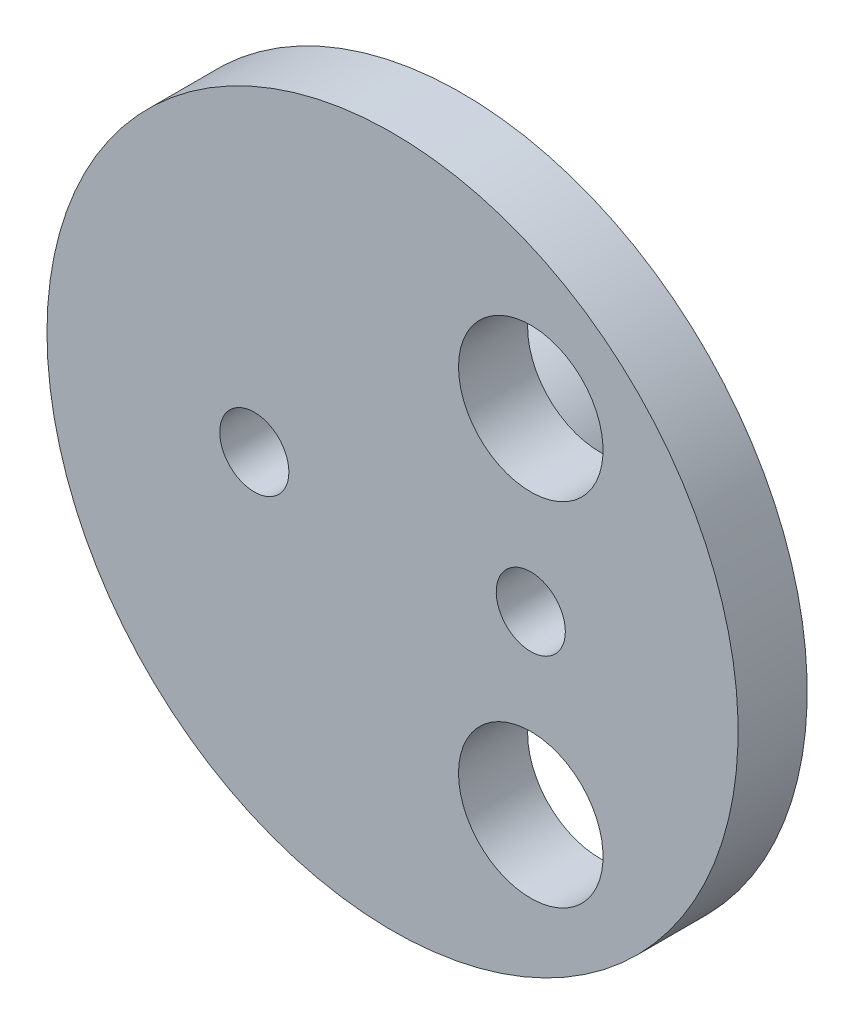
ISO-10303-21;
HEADER;
FILE_DESCRIPTION(('STEP AP214'),'2;1');
FILE_NAME('part.step','',(''),(''),'','','');
FILE_SCHEMA(('AUTOMOTIVE_DESIGN { 1 0 10303 214 1 1 1 1 }'));
ENDSEC;
DATA;
#1=APPLICATION_CONTEXT('core data for automotive mechanical design processes');
#2=APPLICATION_PROTOCOL_DEFINITION('international standard','automotive_design',2000,#1);
#3=PRODUCT_CONTEXT('',#1,'mechanical');
#4=PRODUCT('Part','Part','',(#3));
#5=PRODUCT_RELATED_PRODUCT_CATEGORY('part','',(#4));
#6=PRODUCT_DEFINITION_FORMATION('','',#4);
#7=PRODUCT_DEFINITION_CONTEXT('part definition',#1,'design');
#8=PRODUCT_DEFINITION('design','',#6,#7);
#9=PRODUCT_DEFINITION_SHAPE('','',#8);
#10=(LENGTH_UNIT() NAMED_UNIT(*) SI_UNIT(.MILLI.,.METRE.));
#11=(NAMED_UNIT(*) PLANE_ANGLE_UNIT() SI_UNIT($,.RADIAN.));
#12=(NAMED_UNIT(*) SI_UNIT($,.STERADIAN.) SOLID_ANGLE_UNIT());
#13=UNCERTAINTY_MEASURE_WITH_UNIT(LENGTH_MEASURE(1.E-05),#10,'distance_accuracy_value','');
#14=(GEOMETRIC_REPRESENTATION_CONTEXT(3) GLOBAL_UNCERTAINTY_ASSIGNED_CONTEXT((#13)) GLOBAL_UNIT_ASSIGNED_CONTEXT((#10,
#11,#12)) REPRESENTATION_CONTEXT('',''));
#15=CARTESIAN_POINT('',(0.,0.,0.));
#16=DIRECTION('',(0.,0.,1.));
#17=DIRECTION('',(1.,0.,0.));
#18=AXIS2_PLACEMENT_3D('',#15,#16,#17);
#19=CARTESIAN_POINT('',(2.44249065417534E-12,1.55431223447522E-12,2.5000000000015));
#20=DIRECTION('',(-1.01529895601971E-13,0.,0.999999999999969));
#21=DIRECTION('',(1.,0.,-1.18127729820117E-13));
#22=AXIS2_PLACEMENT_3D('',#19,#20,#21);
#23=PLANE('',#22);
#24=CARTESIAN_POINT('',(4.99999999999412,6.36396103066117,2.50000000010064));
#25=DIRECTION('',(-1.01529895601971E-13,0.,0.999999999999969));
#26=DIRECTION('',(1.,0.,-1.18127729820117E-13));
#27=AXIS2_PLACEMENT_3D('',#24,#25,#26);
#28=CIRCLE('',#27,2.61396103067893);
#29=CARTESIAN_POINT('',(2.38603896931518,6.3639610306612,2.50000000010038));
#30=VERTEX_POINT('',#29);
#31=EDGE_CURVE('E169',#30,#30,#28,.T.);
#32=ORIENTED_EDGE('',*,*,#31,.F.);
#33=EDGE_LOOP('',(#32));
#34=FACE_BOUND('',#33,.T.);
#35=CARTESIAN_POINT('',(4.99999999998835,9.70334923522387E-11,2.50000000010375));
#36=DIRECTION('',(-1.01529895601971E-13,0.,0.999999999999969));
#37=DIRECTION('',(1.,0.,-1.18127729820117E-13));
#38=AXIS2_PLACEMENT_3D('',#35,#36,#37);
#39=CIRCLE('',#38,1.25);
#40=CARTESIAN_POINT('',(6.24999999998835,9.70173160558252E-11,2.50000000010361));
#41=VERTEX_POINT('',#40);
#42=EDGE_CURVE('E89',#41,#41,#39,.T.);
#43=ORIENTED_EDGE('',*,*,#42,.F.);
#44=EDGE_LOOP('',(#43));
#45=FACE_BOUND('',#44,.T.);
#46=CARTESIAN_POINT('',(2.44249065417534E-12,1.55431223447522E-12,2.5000000000015));
#47=DIRECTION('',(-1.01529895601971E-13,0.,0.999999999999969));
#48=DIRECTION('',(1.,0.,-1.18127729820117E-13));
#49=AXIS2_PLACEMENT_3D('',#46,#47,#48);
#50=CIRCLE('',#49,12.5);
#51=CARTESIAN_POINT('',(-12.4999999999976,1.71607519860981E-12,2.50000000000023));
#52=VERTEX_POINT('',#51);
#53=EDGE_CURVE('E93',#52,#52,#50,.T.);
#54=ORIENTED_EDGE('',*,*,#53,.T.);
#55=EDGE_LOOP('',(#54));
#56=FACE_BOUND('',#55,.T.);
#57=CARTESIAN_POINT('',(-5.00000000000078,1.55431223447522E-12,2.5000000000005));
#58=DIRECTION('',(-1.01529895601971E-13,0.,0.999999999999969));
#59=DIRECTION('',(1.,0.,-1.18127729820117E-13));
#60=AXIS2_PLACEMENT_3D('',#57,#58,#59);
#61=CIRCLE('',#60,1.25);
#62=CARTESIAN_POINT('',(-3.75000000000078,1.53813593806174E-12,2.50000000000035));
#63=VERTEX_POINT('',#62);
#64=EDGE_CURVE('E86',#63,#63,#61,.T.);
#65=ORIENTED_EDGE('',*,*,#64,.F.);
#66=EDGE_LOOP('',(#65));
#67=FACE_BOUND('',#66,.T.);
#68=CARTESIAN_POINT('',(5.00000000000123,-6.3639610306776,2.50000000010264));
#69=DIRECTION('',(-1.01529895601971E-13,0.,0.999999999999969));
#70=DIRECTION('',(1.,0.,-1.18127729820117E-13));
#71=AXIS2_PLACEMENT_3D('',#68,#69,#70);
#72=CIRCLE('',#71,2.61396103067893);
#73=CARTESIAN_POINT('',(2.38603896932229,-6.36396103067757,2.50000000010238));
#74=VERTEX_POINT('',#73);
#75=EDGE_CURVE('E164',#74,#74,#72,.T.);
#76=ORIENTED_EDGE('',*,*,#75,.F.);
#77=EDGE_LOOP('',(#76));
#78=FACE_BOUND('',#77,.T.);
#79=ADVANCED_FACE('F39',(#34,#45,#56,#67,#78),#23,.T.);
#80=CARTESIAN_POINT('',(0.,0.,0.));
#81=DIRECTION('',(-1.01529895601971E-13,0.,0.999999999999969));
#82=DIRECTION('',(1.,0.,-1.18127729820117E-13));
#83=AXIS2_PLACEMENT_3D('',#80,#81,#82);
#84=PLANE('',#83);
#85=CARTESIAN_POINT('',(0.,0.,0.));
#86=DIRECTION('',(-1.01529895601971E-13,0.,0.999999999999969));
#87=DIRECTION('',(1.,0.,-1.18127729820117E-13));
#88=AXIS2_PLACEMENT_3D('',#85,#86,#87);
#89=CIRCLE('',#88,12.5);
#90=CARTESIAN_POINT('',(-12.4999999999973,1.49312853747713E-12,-1.26895022267703E-12));
#91=VERTEX_POINT('',#90);
#92=EDGE_CURVE('E43',#91,#91,#89,.T.);
#93=ORIENTED_EDGE('',*,*,#92,.F.);
#94=EDGE_LOOP('',(#93));
#95=FACE_BOUND('',#94,.T.);
#96=CARTESIAN_POINT('',(4.99999999999878,1.11022302462516E-12,1.02917674382752E-10));
#97=DIRECTION('',(-1.01529895601971E-13,0.,0.999999999999969));
#98=DIRECTION('',(1.,0.,-1.18127729820117E-13));
#99=AXIS2_PLACEMENT_3D('',#96,#97,#98);
#100=CIRCLE('',#99,1.25);
#101=CARTESIAN_POINT('',(4.84374999999071,-1.24019592698388,1.0369483049999E-10));
#102=VERTEX_POINT('',#101);
#103=CARTESIAN_POINT('',(4.84374999999515,1.24019592711533,1.0413891970984E-10));
#104=VERTEX_POINT('',#103);
#105=EDGE_CURVE('E82',#102,#104,#100,.T.);
#106=ORIENTED_EDGE('',*,*,#105,.T.);
#107=CARTESIAN_POINT('',(0.,0.,0.));
#108=DIRECTION('',(-1.01529895601971E-13,0.,0.999999999999969));
#109=DIRECTION('',(1.,0.,-1.18127729820117E-13));
#110=AXIS2_PLACEMENT_3D('',#107,#108,#109);
#111=CIRCLE('',#110,5.);
#112=CARTESIAN_POINT('',(-4.84375000000981,1.24019592711444,2.1094237467878E-12));
#113=VERTEX_POINT('',#112);
#114=EDGE_CURVE('E73',#104,#113,#111,.T.);
#115=ORIENTED_EDGE('',*,*,#114,.T.);
#116=CARTESIAN_POINT('',(-5.00000000000034,3.99680288865056E-12,-1.11022302462516E-13));
#117=DIRECTION('',(-1.01529895601971E-13,0.,0.999999999999969));
#118=DIRECTION('',(1.,0.,-1.18127729820117E-13));
#119=AXIS2_PLACEMENT_3D('',#116,#117,#118);
#120=CIRCLE('',#119,1.25);
#121=CARTESIAN_POINT('',(-4.84375000000137,-1.24019592703828,5.55111512312578E-13));
#122=VERTEX_POINT('',#121);
#123=EDGE_CURVE('E178',#113,#122,#120,.T.);
#124=ORIENTED_EDGE('',*,*,#123,.T.);
#125=EDGE_CURVE('E48',#122,#102,#111,.T.);
#126=ORIENTED_EDGE('',*,*,#125,.T.);
#127=EDGE_LOOP('',(#106,#115,#124,#126));
#128=FACE_BOUND('',#127,.T.);
#129=CARTESIAN_POINT('',(4.9999999999879,6.36396103064674,1.04471986617227E-10));
#130=DIRECTION('',(-1.01529895601971E-13,0.,0.999999999999969));
#131=DIRECTION('',(1.,0.,-1.18127729820117E-13));
#132=AXIS2_PLACEMENT_3D('',#129,#130,#131);
#133=CIRCLE('',#132,2.61396103067893);
#134=CARTESIAN_POINT('',(2.38603896931544,6.36396103066098,1.04207007606272E-10));
#135=VERTEX_POINT('',#134);
#136=EDGE_CURVE('E165',#135,#135,#133,.T.);
#137=ORIENTED_EDGE('',*,*,#136,.T.);
#138=EDGE_LOOP('',(#137));
#139=FACE_BOUND('',#138,.T.);
#140=CARTESIAN_POINT('',(4.99999999999723,-6.36396103065895,1.03361763592602E-10));
#141=DIRECTION('',(-1.01529895601971E-13,0.,0.999999999999969));
#142=DIRECTION('',(1.,0.,-1.18127729820117E-13));
#143=AXIS2_PLACEMENT_3D('',#140,#141,#142);
#144=CIRCLE('',#143,2.61396103067893);
#145=CARTESIAN_POINT('',(2.38603896932255,-6.36396103067779,1.03096784581647E-10));
#146=VERTEX_POINT('',#145);
#147=EDGE_CURVE('E166',#146,#146,#144,.T.);
#148=ORIENTED_EDGE('',*,*,#147,.T.);
#149=EDGE_LOOP('',(#148));
#150=FACE_BOUND('',#149,.T.);
#151=ADVANCED_FACE('F83',(#95,#128,#139,#150),#84,.F.);
#152=CARTESIAN_POINT('',(2.44249065417534E-12,1.55431223447522E-12,2.5000000000015));
#153=DIRECTION('',(1.01529895601971E-13,0.,-0.999999999999969));
#154=DIRECTION('',(-1.,0.,1.18127729820117E-13));
#155=AXIS2_PLACEMENT_3D('',#152,#153,#154);
#156=CYLINDRICAL_SURFACE('',#155,12.5);
#157=CARTESIAN_POINT('',(-12.4999999999976,1.71607519860981E-12,2.50000000000023));
#158=CARTESIAN_POINT('',(-12.4999999999976,1.71375283755635E-12,2.47395833333355));
#159=CARTESIAN_POINT('',(-12.4999999999976,1.71143047650288E-12,2.44791666666687));
#160=CARTESIAN_POINT('',(-12.4999999999976,1.70678575439595E-12,2.3958333333335));
#161=CARTESIAN_POINT('',(-12.4999999999976,1.70446339334248E-12,2.36979166666682));
#162=CARTESIAN_POINT('',(-12.4999999999976,1.69981867123555E-12,2.31770833333346));
#163=CARTESIAN_POINT('',(-12.4999999999976,1.69749631018209E-12,2.29166666666677));
#164=CARTESIAN_POINT('',(-12.4999999999976,1.69285158807516E-12,2.23958333333341));
#165=CARTESIAN_POINT('',(-12.4999999999976,1.69052922702169E-12,2.21354166666673));
#166=CARTESIAN_POINT('',(-12.4999999999976,1.68588450491476E-12,2.16145833333336));
#167=CARTESIAN_POINT('',(-12.4999999999976,1.6835621438613E-12,2.13541666666668));
#168=CARTESIAN_POINT('',(-12.4999999999976,1.67891742175436E-12,2.08333333333332));
#169=CARTESIAN_POINT('',(-12.4999999999976,1.6765950607009E-12,2.05729166666663));
#170=CARTESIAN_POINT('',(-12.4999999999975,1.67195033859397E-12,2.00520833333327));
#171=CARTESIAN_POINT('',(-12.4999999999975,1.6696279775405E-12,1.97916666666659));
#172=CARTESIAN_POINT('',(-12.4999999999975,1.66498325543357E-12,1.92708333333322));
#173=CARTESIAN_POINT('',(-12.4999999999975,1.66266089438011E-12,1.90104166666654));
#174=CARTESIAN_POINT('',(-12.4999999999975,1.65801617227318E-12,1.84895833333317));
#175=CARTESIAN_POINT('',(-12.4999999999975,1.65569381121971E-12,1.82291666666649));
#176=CARTESIAN_POINT('',(-12.4999999999975,1.65104908911278E-12,1.77083333333313));
#177=CARTESIAN_POINT('',(-12.4999999999975,1.64872672805931E-12,1.74479166666645));
#178=CARTESIAN_POINT('',(-12.4999999999975,1.64408200595238E-12,1.69270833333308));
#179=CARTESIAN_POINT('',(-12.4999999999975,1.64175964489892E-12,1.6666666666664));
#180=CARTESIAN_POINT('',(-12.4999999999975,1.63711492279199E-12,1.61458333333303));
#181=CARTESIAN_POINT('',(-12.4999999999975,1.63479256173852E-12,1.58854166666635));
#182=CARTESIAN_POINT('',(-12.4999999999975,1.63014783963159E-12,1.53645833333299));
#183=CARTESIAN_POINT('',(-12.4999999999975,1.62782547857813E-12,1.5104166666663));
#184=CARTESIAN_POINT('',(-12.4999999999975,1.62318075647119E-12,1.45833333333294));
#185=CARTESIAN_POINT('',(-12.4999999999975,1.62085839541773E-12,1.43229166666626));
#186=CARTESIAN_POINT('',(-12.4999999999975,1.6162136733108E-12,1.38020833333289));
#187=CARTESIAN_POINT('',(-12.4999999999975,1.61389131225733E-12,1.35416666666621));
#188=CARTESIAN_POINT('',(-12.4999999999975,1.6092465901504E-12,1.30208333333285));
#189=CARTESIAN_POINT('',(-12.4999999999975,1.60692422909694E-12,1.27604166666616));
#190=CARTESIAN_POINT('',(-12.4999999999975,1.60227950699001E-12,1.2239583333328));
#191=CARTESIAN_POINT('',(-12.4999999999975,1.59995714593654E-12,1.19791666666612));
#192=CARTESIAN_POINT('',(-12.4999999999975,1.59531242382961E-12,1.14583333333275));
#193=CARTESIAN_POINT('',(-12.4999999999975,1.59299006277614E-12,1.11979166666607));
#194=CARTESIAN_POINT('',(-12.4999999999975,1.58834534066921E-12,1.06770833333271));
#195=CARTESIAN_POINT('',(-12.4999999999974,1.58602297961575E-12,1.04166666666602));
#196=CARTESIAN_POINT('',(-12.4999999999974,1.58137825750882E-12,0.989583333332659));
#197=CARTESIAN_POINT('',(-12.4999999999974,1.57905589645535E-12,0.963541666665976));
#198=CARTESIAN_POINT('',(-12.4999999999974,1.57441117434842E-12,0.911458333332612));
#199=CARTESIAN_POINT('',(-12.4999999999974,1.57208881329496E-12,0.885416666665929));
#200=CARTESIAN_POINT('',(-12.4999999999974,1.56744409118802E-12,0.833333333332565));
#201=CARTESIAN_POINT('',(-12.4999999999974,1.56512173013456E-12,0.807291666665882));
#202=CARTESIAN_POINT('',(-12.4999999999974,1.56047700802763E-12,0.755208333332518));
#203=CARTESIAN_POINT('',(-12.4999999999974,1.55815464697416E-12,0.729166666665836));
#204=CARTESIAN_POINT('',(-12.4999999999974,1.55350992486723E-12,0.677083333332471));
#205=CARTESIAN_POINT('',(-12.4999999999974,1.55118756381377E-12,0.651041666665788));
#206=CARTESIAN_POINT('',(-12.4999999999974,1.54654284170684E-12,0.598958333332424));
#207=CARTESIAN_POINT('',(-12.4999999999974,1.54422048065337E-12,0.572916666665742));
#208=CARTESIAN_POINT('',(-12.4999999999974,1.53957575854644E-12,0.520833333332377));
#209=CARTESIAN_POINT('',(-12.4999999999974,1.53725339749297E-12,0.494791666665695));
#210=CARTESIAN_POINT('',(-12.4999999999974,1.53260867538604E-12,0.44270833333233));
#211=CARTESIAN_POINT('',(-12.4999999999974,1.53028631433258E-12,0.416666666665648));
#212=CARTESIAN_POINT('',(-12.4999999999974,1.52564159222565E-12,0.364583333332284));
#213=CARTESIAN_POINT('',(-12.4999999999974,1.52331923117218E-12,0.338541666665601));
#214=CARTESIAN_POINT('',(-12.4999999999974,1.51867450906525E-12,0.286458333332237));
#215=CARTESIAN_POINT('',(-12.4999999999974,1.51635214801179E-12,0.260416666665554));
#216=CARTESIAN_POINT('',(-12.4999999999974,1.51170742590485E-12,0.20833333333219));
#217=CARTESIAN_POINT('',(-12.4999999999974,1.50938506485139E-12,0.182291666665507));
#218=CARTESIAN_POINT('',(-12.4999999999974,1.50474034274446E-12,0.130208333332143));
#219=CARTESIAN_POINT('',(-12.4999999999974,1.50241798169099E-12,0.104166666665461));
#220=CARTESIAN_POINT('',(-12.4999999999973,1.49777325958406E-12,0.0520833333320959));
#221=CARTESIAN_POINT('',(-12.4999999999973,1.4954508985306E-12,0.0260416666654135));
#222=CARTESIAN_POINT('',(-12.4999999999973,1.49312853747713E-12,-1.26895022267703E-12));
#223=B_SPLINE_CURVE_WITH_KNOTS('',3,(#157,#158,#159,#160,#161,#162,#163,#164,#165,#166,#167,
#168,#169,#170,#171,#172,#173,#174,#175,#176,#177,#178,#179,#180,#181,#182,#183,#184,#185,#186,
#187,#188,#189,#190,#191,#192,#193,#194,#195,#196,#197,#198,#199,#200,#201,#202,#203,#204,#205,
#206,#207,#208,#209,#210,#211,#212,#213,#214,#215,#216,#217,#218,#219,#220,#221,#222),
.UNSPECIFIED.,.F.,.F.,(4,2,2,2,2,2,2,2,2,2,2,2,2,2,2,2,2,2,2,2,2,2,2,2,2,2,2,2,2,2,2,2,4),(0.,
0.0781250000000469,0.156250000000094,0.234375000000141,0.312500000000188,0.390625000000235,
0.468750000000281,0.546875000000329,0.625000000000375,0.703125000000422,0.781250000000469,
0.859375000000516,0.937500000000563,1.01562500000061,1.09375000000066,1.1718750000007,
1.25000000000075,1.3281250000008,1.40625000000084,1.48437500000089,1.56250000000094,
1.64062500000098,1.71875000000103,1.79687500000108,1.87500000000113,1.95312500000117,
2.03125000000122,2.10937500000127,2.18750000000131,2.26562500000136,2.34375000000141,
2.42187500000145,2.5000000000015),.UNSPECIFIED.);
#224=EDGE_CURVE('BSEAM41',#52,#91,#223,.T.);
#225=ORIENTED_EDGE('',*,*,#53,.F.);
#226=ORIENTED_EDGE('',*,*,#92,.T.);
#227=ORIENTED_EDGE('',*,*,#224,.T.);
#228=ORIENTED_EDGE('',*,*,#224,.F.);
#229=EDGE_LOOP('',(#225,#227,#226,#228));
#230=FACE_BOUND('',#229,.T.);
#231=ADVANCED_FACE('F41',(#230),#156,.T.);
#232=CARTESIAN_POINT('',(4.99999999998835,9.70334923522387E-11,2.50000000010375));
#233=DIRECTION('',(1.01529895601971E-13,0.,-0.999999999999969));
#234=DIRECTION('',(-1.,0.,1.18127729820117E-13));
#235=AXIS2_PLACEMENT_3D('',#232,#233,#234);
#236=CYLINDRICAL_SURFACE('',#235,1.25);
#237=ORIENTED_EDGE('',*,*,#42,.T.);
#238=EDGE_LOOP('',(#237));
#239=FACE_BOUND('',#238,.T.);
#240=EDGE_CURVE('E69',#104,#102,#100,.T.);
#241=ORIENTED_EDGE('',*,*,#240,.F.);
#242=ORIENTED_EDGE('',*,*,#105,.F.);
#243=EDGE_LOOP('',(#241,#242));
#244=FACE_BOUND('',#243,.T.);
#245=ADVANCED_FACE('F88',(#239,#244),#236,.F.);
#246=CARTESIAN_POINT('',(-5.00000000000078,1.55431223447522E-12,2.5000000000005));
#247=DIRECTION('',(1.01529895601971E-13,0.,-0.999999999999969));
#248=DIRECTION('',(-1.,0.,1.18127729820117E-13));
#249=AXIS2_PLACEMENT_3D('',#246,#247,#248);
#250=CYLINDRICAL_SURFACE('',#249,1.25);
#251=ORIENTED_EDGE('',*,*,#64,.T.);
#252=EDGE_LOOP('',(#251));
#253=FACE_BOUND('',#252,.T.);
#254=ORIENTED_EDGE('',*,*,#123,.F.);
#255=EDGE_CURVE('E176',#122,#113,#120,.T.);
#256=ORIENTED_EDGE('',*,*,#255,.F.);
#257=EDGE_LOOP('',(#254,#256));
#258=FACE_BOUND('',#257,.T.);
#259=ADVANCED_FACE('F146',(#253,#258),#250,.F.);
#260=CARTESIAN_POINT('',(4.99999999999412,6.36396103066117,2.50000000010064));
#261=DIRECTION('',(1.01529895601971E-13,0.,-0.999999999999969));
#262=DIRECTION('',(-1.,0.,1.18127729820117E-13));
#263=AXIS2_PLACEMENT_3D('',#260,#261,#262);
#264=CYLINDRICAL_SURFACE('',#263,2.61396103067893);
#265=CARTESIAN_POINT('',(2.38603896931518,6.3639610306612,2.50000000010038));
#266=CARTESIAN_POINT('',(2.38603896931519,6.3639610306612,2.47395833343375));
#267=CARTESIAN_POINT('',(2.38603896931519,6.3639610306612,2.44791666676713));
#268=CARTESIAN_POINT('',(2.38603896931519,6.36396103066119,2.39583333343387));
#269=CARTESIAN_POINT('',(2.3860389693152,6.36396103066119,2.36979166676724));
#270=CARTESIAN_POINT('',(2.3860389693152,6.36396103066119,2.31770833343399));
#271=CARTESIAN_POINT('',(2.38603896931521,6.36396103066119,2.29166666676736));
#272=CARTESIAN_POINT('',(2.38603896931521,6.36396103066118,2.23958333343411));
#273=CARTESIAN_POINT('',(2.38603896931521,6.36396103066118,2.21354166676748));
#274=CARTESIAN_POINT('',(2.38603896931522,6.36396103066117,2.16145833343423));
#275=CARTESIAN_POINT('',(2.38603896931522,6.36396103066117,2.1354166667676));
#276=CARTESIAN_POINT('',(2.38603896931523,6.36396103066117,2.08333333343435));
#277=CARTESIAN_POINT('',(2.38603896931523,6.36396103066116,2.05729166676772));
#278=CARTESIAN_POINT('',(2.38603896931523,6.36396103066116,2.00520833343447));
#279=CARTESIAN_POINT('',(2.38603896931524,6.36396103066116,1.97916666676784));
#280=CARTESIAN_POINT('',(2.38603896931524,6.36396103066115,1.92708333343459));
#281=CARTESIAN_POINT('',(2.38603896931524,6.36396103066115,1.90104166676796));
#282=CARTESIAN_POINT('',(2.38603896931525,6.36396103066115,1.84895833343471));
#283=CARTESIAN_POINT('',(2.38603896931525,6.36396103066114,1.82291666676808));
#284=CARTESIAN_POINT('',(2.38603896931526,6.36396103066114,1.77083333343483));
#285=CARTESIAN_POINT('',(2.38603896931526,6.36396103066114,1.7447916667682));
#286=CARTESIAN_POINT('',(2.38603896931527,6.36396103066113,1.69270833343495));
#287=CARTESIAN_POINT('',(2.38603896931527,6.36396103066113,1.66666666676832));
#288=CARTESIAN_POINT('',(2.38603896931527,6.36396103066112,1.61458333343507));
#289=CARTESIAN_POINT('',(2.38603896931528,6.36396103066112,1.58854166676844));
#290=CARTESIAN_POINT('',(2.38603896931528,6.36396103066112,1.53645833343519));
#291=CARTESIAN_POINT('',(2.38603896931528,6.36396103066112,1.51041666676856));
#292=CARTESIAN_POINT('',(2.38603896931529,6.36396103066111,1.45833333343531));
#293=CARTESIAN_POINT('',(2.38603896931529,6.36396103066111,1.43229166676868));
#294=CARTESIAN_POINT('',(2.3860389693153,6.3639610306611,1.38020833343543));
#295=CARTESIAN_POINT('',(2.3860389693153,6.3639610306611,1.3541666667688));
#296=CARTESIAN_POINT('',(2.38603896931531,6.3639610306611,1.30208333343555));
#297=CARTESIAN_POINT('',(2.38603896931531,6.36396103066109,1.27604166676892));
#298=CARTESIAN_POINT('',(2.38603896931531,6.36396103066109,1.22395833343567));
#299=CARTESIAN_POINT('',(2.38603896931532,6.36396103066109,1.19791666676904));
#300=CARTESIAN_POINT('',(2.38603896931532,6.36396103066108,1.14583333343579));
#301=CARTESIAN_POINT('',(2.38603896931532,6.36396103066108,1.11979166676916));
#302=CARTESIAN_POINT('',(2.38603896931533,6.36396103066108,1.06770833343591));
#303=CARTESIAN_POINT('',(2.38603896931533,6.36396103066107,1.04166666676928));
#304=CARTESIAN_POINT('',(2.38603896931534,6.36396103066107,0.989583333436025));
#305=CARTESIAN_POINT('',(2.38603896931534,6.36396103066107,0.963541666769398));
#306=CARTESIAN_POINT('',(2.38603896931534,6.36396103066106,0.911458333436145));
#307=CARTESIAN_POINT('',(2.38603896931535,6.36396103066106,0.885416666769518));
#308=CARTESIAN_POINT('',(2.38603896931535,6.36396103066105,0.833333333436264));
#309=CARTESIAN_POINT('',(2.38603896931536,6.36396103066105,0.807291666769638));
#310=CARTESIAN_POINT('',(2.38603896931536,6.36396103066105,0.755208333436384));
#311=CARTESIAN_POINT('',(2.38603896931536,6.36396103066105,0.729166666769757));
#312=CARTESIAN_POINT('',(2.38603896931537,6.36396103066104,0.677083333436504));
#313=CARTESIAN_POINT('',(2.38603896931537,6.36396103066104,0.651041666769877));
#314=CARTESIAN_POINT('',(2.38603896931538,6.36396103066103,0.598958333436623));
#315=CARTESIAN_POINT('',(2.38603896931538,6.36396103066103,0.572916666769996));
#316=CARTESIAN_POINT('',(2.38603896931538,6.36396103066103,0.520833333436743));
#317=CARTESIAN_POINT('',(2.38603896931539,6.36396103066102,0.494791666770116));
#318=CARTESIAN_POINT('',(2.38603896931539,6.36396103066102,0.442708333436863));
#319=CARTESIAN_POINT('',(2.3860389693154,6.36396103066102,0.416666666770236));
#320=CARTESIAN_POINT('',(2.3860389693154,6.36396103066101,0.364583333436982));
#321=CARTESIAN_POINT('',(2.3860389693154,6.36396103066101,0.338541666770355));
#322=CARTESIAN_POINT('',(2.38603896931541,6.36396103066101,0.286458333437102));
#323=CARTESIAN_POINT('',(2.38603896931541,6.363961030661,0.260416666770475));
#324=CARTESIAN_POINT('',(2.38603896931542,6.363961030661,0.208333333437222));
#325=CARTESIAN_POINT('',(2.38603896931542,6.363961030661,0.182291666770595));
#326=CARTESIAN_POINT('',(2.38603896931542,6.36396103066099,0.130208333437341));
#327=CARTESIAN_POINT('',(2.38603896931543,6.36396103066099,0.104166666770714));
#328=CARTESIAN_POINT('',(2.38603896931543,6.36396103066098,0.0520833334374609));
#329=CARTESIAN_POINT('',(2.38603896931543,6.36396103066098,0.0260416667708339));
#330=CARTESIAN_POINT('',(2.38603896931544,6.36396103066098,1.04207007606272E-10));
#331=B_SPLINE_CURVE_WITH_KNOTS('',3,(#265,#266,#267,#268,#269,#270,#271,#272,#273,#274,#275,
#276,#277,#278,#279,#280,#281,#282,#283,#284,#285,#286,#287,#288,#289,#290,#291,#292,#293,#294,
#295,#296,#297,#298,#299,#300,#301,#302,#303,#304,#305,#306,#307,#308,#309,#310,#311,#312,#313,
#314,#315,#316,#317,#318,#319,#320,#321,#322,#323,#324,#325,#326,#327,#328,#329,#330),
.UNSPECIFIED.,.F.,.F.,(4,2,2,2,2,2,2,2,2,2,2,2,2,2,2,2,2,2,2,2,2,2,2,2,2,2,2,2,2,2,2,2,4),(0.,
0.0781249999998808,0.156249999999761,0.234374999999642,0.312499999999522,0.390624999999402,
0.468749999999283,0.546874999999163,0.624999999999043,0.703124999998924,0.781249999998804,
0.859374999998684,0.937499999998565,1.01562499999845,1.09374999999833,1.17187499999821,
1.24999999999809,1.32812499999797,1.40624999999785,1.48437499999773,1.56249999999761,
1.64062499999749,1.71874999999737,1.79687499999725,1.87499999999713,1.95312499999701,
2.03124999999689,2.10937499999677,2.18749999999665,2.26562499999653,2.34374999999641,
2.42187499999629,2.49999999999617),.UNSPECIFIED.);
#332=EDGE_CURVE('BSEAM142',#30,#135,#331,.T.);
#333=ORIENTED_EDGE('',*,*,#31,.T.);
#334=ORIENTED_EDGE('',*,*,#136,.F.);
#335=ORIENTED_EDGE('',*,*,#332,.T.);
#336=ORIENTED_EDGE('',*,*,#332,.F.);
#337=EDGE_LOOP('',(#333,#335,#334,#336));
#338=FACE_BOUND('',#337,.T.);
#339=ADVANCED_FACE('F142',(#338),#264,.F.);
#340=CARTESIAN_POINT('',(5.00000000000123,-6.3639610306776,2.50000000010264));
#341=DIRECTION('',(1.01529895601971E-13,0.,-0.999999999999969));
#342=DIRECTION('',(-1.,0.,1.18127729820117E-13));
#343=AXIS2_PLACEMENT_3D('',#340,#341,#342);
#344=CYLINDRICAL_SURFACE('',#343,2.61396103067893);
#345=CARTESIAN_POINT('',(2.38603896932229,-6.36396103067757,2.50000000010238));
#346=CARTESIAN_POINT('',(2.38603896932229,-6.36396103067757,2.47395833343572));
#347=CARTESIAN_POINT('',(2.3860389693223,-6.36396103067757,2.44791666676906));
#348=CARTESIAN_POINT('',(2.3860389693223,-6.36396103067758,2.39583333343574));
#349=CARTESIAN_POINT('',(2.3860389693223,-6.36396103067758,2.36979166676908));
#350=CARTESIAN_POINT('',(2.38603896932231,-6.36396103067758,2.31770833343576));
#351=CARTESIAN_POINT('',(2.38603896932231,-6.36396103067758,2.2916666667691));
#352=CARTESIAN_POINT('',(2.38603896932232,-6.36396103067759,2.23958333343579));
#353=CARTESIAN_POINT('',(2.38603896932232,-6.36396103067759,2.21354166676913));
#354=CARTESIAN_POINT('',(2.38603896932233,-6.3639610306776,2.16145833343581));
#355=CARTESIAN_POINT('',(2.38603896932233,-6.3639610306776,2.13541666676915));
#356=CARTESIAN_POINT('',(2.38603896932233,-6.3639610306776,2.08333333343583));
#357=CARTESIAN_POINT('',(2.38603896932234,-6.36396103067761,2.05729166676917));
#358=CARTESIAN_POINT('',(2.38603896932234,-6.36396103067761,2.00520833343585));
#359=CARTESIAN_POINT('',(2.38603896932234,-6.36396103067761,1.97916666676919));
#360=CARTESIAN_POINT('',(2.38603896932235,-6.36396103067762,1.92708333343588));
#361=CARTESIAN_POINT('',(2.38603896932235,-6.36396103067762,1.90104166676922));
#362=CARTESIAN_POINT('',(2.38603896932236,-6.36396103067762,1.8489583334359));
#363=CARTESIAN_POINT('',(2.38603896932236,-6.36396103067763,1.82291666676924));
#364=CARTESIAN_POINT('',(2.38603896932237,-6.36396103067763,1.77083333343592));
#365=CARTESIAN_POINT('',(2.38603896932237,-6.36396103067763,1.74479166676926));
#366=CARTESIAN_POINT('',(2.38603896932237,-6.36396103067764,1.69270833343594));
#367=CARTESIAN_POINT('',(2.38603896932238,-6.36396103067764,1.66666666676928));
#368=CARTESIAN_POINT('',(2.38603896932238,-6.36396103067765,1.61458333343597));
#369=CARTESIAN_POINT('',(2.38603896932238,-6.36396103067765,1.58854166676931));
#370=CARTESIAN_POINT('',(2.38603896932239,-6.36396103067765,1.53645833343599));
#371=CARTESIAN_POINT('',(2.38603896932239,-6.36396103067765,1.51041666676933));
#372=CARTESIAN_POINT('',(2.3860389693224,-6.36396103067766,1.45833333343601));
#373=CARTESIAN_POINT('',(2.3860389693224,-6.36396103067766,1.43229166676935));
#374=CARTESIAN_POINT('',(2.38603896932241,-6.36396103067767,1.38020833343603));
#375=CARTESIAN_POINT('',(2.38603896932241,-6.36396103067767,1.35416666676937));
#376=CARTESIAN_POINT('',(2.38603896932241,-6.36396103067767,1.30208333343606));
#377=CARTESIAN_POINT('',(2.38603896932242,-6.36396103067768,1.2760416667694));
#378=CARTESIAN_POINT('',(2.38603896932242,-6.36396103067768,1.22395833343608));
#379=CARTESIAN_POINT('',(2.38603896932242,-6.36396103067768,1.19791666676942));
#380=CARTESIAN_POINT('',(2.38603896932243,-6.36396103067769,1.1458333334361));
#381=CARTESIAN_POINT('',(2.38603896932243,-6.36396103067769,1.11979166676944));
#382=CARTESIAN_POINT('',(2.38603896932244,-6.36396103067769,1.06770833343612));
#383=CARTESIAN_POINT('',(2.38603896932244,-6.3639610306777,1.04166666676946));
#384=CARTESIAN_POINT('',(2.38603896932244,-6.3639610306777,0.989583333436145));
#385=CARTESIAN_POINT('',(2.38603896932245,-6.3639610306777,0.963541666769486));
#386=CARTESIAN_POINT('',(2.38603896932245,-6.36396103067771,0.911458333436168));
#387=CARTESIAN_POINT('',(2.38603896932246,-6.36396103067771,0.885416666769509));
#388=CARTESIAN_POINT('',(2.38603896932246,-6.36396103067772,0.833333333436191));
#389=CARTESIAN_POINT('',(2.38603896932246,-6.36396103067772,0.807291666769531));
#390=CARTESIAN_POINT('',(2.38603896932247,-6.36396103067772,0.755208333436213));
#391=CARTESIAN_POINT('',(2.38603896932247,-6.36396103067773,0.729166666769554));
#392=CARTESIAN_POINT('',(2.38603896932248,-6.36396103067773,0.677083333436236));
#393=CARTESIAN_POINT('',(2.38603896932248,-6.36396103067773,0.651041666769576));
#394=CARTESIAN_POINT('',(2.38603896932248,-6.36396103067774,0.598958333436258));
#395=CARTESIAN_POINT('',(2.38603896932249,-6.36396103067774,0.572916666769599));
#396=CARTESIAN_POINT('',(2.38603896932249,-6.36396103067774,0.52083333343628));
#397=CARTESIAN_POINT('',(2.3860389693225,-6.36396103067775,0.494791666769621));
#398=CARTESIAN_POINT('',(2.3860389693225,-6.36396103067775,0.442708333436303));
#399=CARTESIAN_POINT('',(2.3860389693225,-6.36396103067775,0.416666666769644));
#400=CARTESIAN_POINT('',(2.38603896932251,-6.36396103067776,0.364583333436325));
#401=CARTESIAN_POINT('',(2.38603896932251,-6.36396103067776,0.338541666769666));
#402=CARTESIAN_POINT('',(2.38603896932252,-6.36396103067776,0.286458333436348));
#403=CARTESIAN_POINT('',(2.38603896932252,-6.36396103067777,0.260416666769689));
#404=CARTESIAN_POINT('',(2.38603896932252,-6.36396103067777,0.20833333343637));
#405=CARTESIAN_POINT('',(2.38603896932253,-6.36396103067777,0.182291666769711));
#406=CARTESIAN_POINT('',(2.38603896932253,-6.36396103067778,0.130208333436393));
#407=CARTESIAN_POINT('',(2.38603896932253,-6.36396103067778,0.104166666769734));
#408=CARTESIAN_POINT('',(2.38603896932254,-6.36396103067779,0.0520833334364154));
#409=CARTESIAN_POINT('',(2.38603896932254,-6.36396103067779,0.0260416667697561));
#410=CARTESIAN_POINT('',(2.38603896932255,-6.36396103067779,1.03096784581647E-10));
#411=B_SPLINE_CURVE_WITH_KNOTS('',3,(#345,#346,#347,#348,#349,#350,#351,#352,#353,#354,#355,
#356,#357,#358,#359,#360,#361,#362,#363,#364,#365,#366,#367,#368,#369,#370,#371,#372,#373,#374,
#375,#376,#377,#378,#379,#380,#381,#382,#383,#384,#385,#386,#387,#388,#389,#390,#391,#392,#393,
#394,#395,#396,#397,#398,#399,#400,#401,#402,#403,#404,#405,#406,#407,#408,#409,#410),
.UNSPECIFIED.,.F.,.F.,(4,2,2,2,2,2,2,2,2,2,2,2,2,2,2,2,2,2,2,2,2,2,2,2,2,2,2,2,2,2,2,2,4),(0.,
0.0781249999999771,0.156249999999955,0.234374999999932,0.31249999999991,0.390624999999887,
0.468749999999865,0.546874999999842,0.62499999999982,0.703124999999797,0.781249999999775,
0.859374999999752,0.93749999999973,1.01562499999971,1.09374999999968,1.17187499999966,
1.24999999999964,1.32812499999962,1.40624999999959,1.48437499999957,1.56249999999955,
1.64062499999953,1.7187499999995,1.79687499999948,1.87499999999946,1.95312499999944,
2.03124999999942,2.10937499999939,2.18749999999937,2.26562499999935,2.34374999999932,
2.4218749999993,2.49999999999928),.UNSPECIFIED.);
#412=EDGE_CURVE('BSEAM140',#74,#146,#411,.T.);
#413=ORIENTED_EDGE('',*,*,#75,.T.);
#414=ORIENTED_EDGE('',*,*,#147,.F.);
#415=ORIENTED_EDGE('',*,*,#412,.T.);
#416=ORIENTED_EDGE('',*,*,#412,.F.);
#417=EDGE_LOOP('',(#413,#415,#414,#416));
#418=FACE_BOUND('',#417,.T.);
#419=ADVANCED_FACE('F140',(#418),#344,.F.);
#420=CARTESIAN_POINT('',(0.,0.,0.));
#421=DIRECTION('',(-1.01529895601971E-13,0.,0.999999999999969));
#422=DIRECTION('',(1.,0.,-1.18127729820117E-13));
#423=AXIS2_PLACEMENT_3D('',#420,#421,#422);
#424=PLANE('',#423);
#425=EDGE_CURVE('E56',#102,#104,#111,.T.);
#426=ORIENTED_EDGE('',*,*,#425,.T.);
#427=ORIENTED_EDGE('',*,*,#240,.T.);
#428=EDGE_LOOP('',(#426,#427));
#429=FACE_BOUND('',#428,.T.);
#430=ADVANCED_FACE('F67',(#429),#424,.T.);
#431=CARTESIAN_POINT('',(4.44089209850063E-13,2.44249065417534E-12,-3.49999999999973));
#432=DIRECTION('',(-1.01529895601971E-13,0.,0.999999999999969));
#433=DIRECTION('',(1.,0.,-1.18127729820117E-13));
#434=AXIS2_PLACEMENT_3D('',#431,#432,#433);
#435=CYLINDRICAL_SURFACE('',#434,5.);
#436=CARTESIAN_POINT('',(4.44089209850063E-13,2.44249065417534E-12,-3.49999999999973));
#437=DIRECTION('',(-1.01529895601971E-13,0.,0.999999999999969));
#438=DIRECTION('',(1.,0.,-1.18127729820117E-13));
#439=AXIS2_PLACEMENT_3D('',#436,#437,#438);
#440=CIRCLE('',#439,5.);
#441=CARTESIAN_POINT('',(5.00000000000046,2.37778546852141E-12,-3.50000000000032));
#442=VERTEX_POINT('',#441);
#443=EDGE_CURVE('E80',#442,#442,#440,.T.);
#444=ORIENTED_EDGE('',*,*,#443,.T.);
#445=EDGE_LOOP('',(#444));
#446=FACE_BOUND('',#445,.T.);
#447=ORIENTED_EDGE('',*,*,#114,.F.);
#448=ORIENTED_EDGE('',*,*,#425,.F.);
#449=ORIENTED_EDGE('',*,*,#125,.F.);
#450=EDGE_CURVE('E70',#113,#122,#111,.T.);
#451=ORIENTED_EDGE('',*,*,#450,.F.);
#452=EDGE_LOOP('',(#447,#448,#449,#451));
#453=FACE_BOUND('',#452,.T.);
#454=ADVANCED_FACE('F76',(#446,#453),#435,.T.);
#455=CARTESIAN_POINT('',(4.44089209850063E-13,2.44249065417534E-12,-3.49999999999973));
#456=DIRECTION('',(-1.01529895601971E-13,0.,0.999999999999969));
#457=DIRECTION('',(1.,0.,-1.18127729820117E-13));
#458=AXIS2_PLACEMENT_3D('',#455,#456,#457);
#459=PLANE('',#458);
#460=CARTESIAN_POINT('',(4.44089209850063E-13,2.44249065417534E-12,-3.49999999999973));
#461=DIRECTION('',(-1.01529895601971E-13,0.,0.999999999999969));
#462=DIRECTION('',(1.,0.,-1.18127729820117E-13));
#463=AXIS2_PLACEMENT_3D('',#460,#461,#462);
#464=CIRCLE('',#463,2.9);
#465=CARTESIAN_POINT('',(2.90000000000045,2.40496164649612E-12,-3.49999999999943));
#466=VERTEX_POINT('',#465);
#467=EDGE_CURVE('E71',#466,#466,#464,.T.);
#468=ORIENTED_EDGE('',*,*,#467,.T.);
#469=EDGE_LOOP('',(#468));
#470=FACE_BOUND('',#469,.T.);
#471=ORIENTED_EDGE('',*,*,#443,.F.);
#472=EDGE_LOOP('',(#471));
#473=FACE_BOUND('',#472,.T.);
#474=ADVANCED_FACE('F129',(#470,#473),#459,.F.);
#475=ORIENTED_EDGE('',*,*,#450,.T.);
#476=ORIENTED_EDGE('',*,*,#255,.T.);
#477=EDGE_LOOP('',(#475,#476));
#478=FACE_BOUND('',#477,.T.);
#479=ADVANCED_FACE('F120',(#478),#424,.T.);
#480=CARTESIAN_POINT('',(4.44089209850063E-13,2.44249065417534E-12,-3.49999999999973));
#481=DIRECTION('',(-1.01529895601971E-13,0.,0.999999999999969));
#482=DIRECTION('',(1.,0.,-1.18127729820117E-13));
#483=AXIS2_PLACEMENT_3D('',#480,#481,#482);
#484=CYLINDRICAL_SURFACE('',#483,2.9);
#485=CARTESIAN_POINT('',(0.,0.,0.));
#486=DIRECTION('',(-1.01529895601971E-13,0.,0.999999999999969));
#487=DIRECTION('',(1.,0.,-1.18127729820117E-13));
#488=AXIS2_PLACEMENT_3D('',#485,#486,#487);
#489=CIRCLE('',#488,2.9);
#490=CARTESIAN_POINT('',(2.9000000000001,2.71708697208166E-12,2.94035629178069E-13));
#491=VERTEX_POINT('',#490);
#492=EDGE_CURVE('E11',#491,#491,#489,.T.);
#493=CARTESIAN_POINT('',(2.90000000000045,2.40496164649612E-12,-3.49999999999943));
#494=CARTESIAN_POINT('',(2.90000000000045,2.40821295197097E-12,-3.4635416666661));
#495=CARTESIAN_POINT('',(2.90000000000044,2.41146425744582E-12,-3.42708333333277));
#496=CARTESIAN_POINT('',(2.90000000000044,2.41796686839552E-12,-3.35416666666611));
#497=CARTESIAN_POINT('',(2.90000000000043,2.42121817387037E-12,-3.31770833333278));
#498=CARTESIAN_POINT('',(2.90000000000043,2.42772078482006E-12,-3.24479166666612));
#499=CARTESIAN_POINT('',(2.90000000000042,2.43097209029491E-12,-3.20833333333279));
#500=CARTESIAN_POINT('',(2.90000000000041,2.43747470124461E-12,-3.13541666666613));
#501=CARTESIAN_POINT('',(2.90000000000041,2.44072600671946E-12,-3.0989583333328));
#502=CARTESIAN_POINT('',(2.9000000000004,2.44722861766916E-12,-3.02604166666614));
#503=CARTESIAN_POINT('',(2.9000000000004,2.45047992314401E-12,-2.98958333333281));
#504=CARTESIAN_POINT('',(2.90000000000039,2.45698253409371E-12,-2.91666666666614));
#505=CARTESIAN_POINT('',(2.90000000000039,2.46023383956856E-12,-2.88020833333281));
#506=CARTESIAN_POINT('',(2.90000000000038,2.46673645051826E-12,-2.80729166666615));
#507=CARTESIAN_POINT('',(2.90000000000038,2.46998775599311E-12,-2.77083333333282));
#508=CARTESIAN_POINT('',(2.90000000000037,2.47649036694281E-12,-2.69791666666616));
#509=CARTESIAN_POINT('',(2.90000000000037,2.47974167241765E-12,-2.66145833333283));
#510=CARTESIAN_POINT('',(2.90000000000036,2.48624428336735E-12,-2.58854166666617));
#511=CARTESIAN_POINT('',(2.90000000000036,2.4894955888422E-12,-2.55208333333284));
#512=CARTESIAN_POINT('',(2.90000000000035,2.4959981997919E-12,-2.47916666666618));
#513=CARTESIAN_POINT('',(2.90000000000034,2.49924950526675E-12,-2.44270833333285));
#514=CARTESIAN_POINT('',(2.90000000000034,2.50575211621645E-12,-2.36979166666619));
#515=CARTESIAN_POINT('',(2.90000000000033,2.5090034216913E-12,-2.33333333333286));
#516=CARTESIAN_POINT('',(2.90000000000033,2.515506032641E-12,-2.2604166666662));
#517=CARTESIAN_POINT('',(2.90000000000032,2.51875733811585E-12,-2.22395833333286));
#518=CARTESIAN_POINT('',(2.90000000000032,2.52525994906555E-12,-2.1510416666662));
#519=CARTESIAN_POINT('',(2.90000000000031,2.5285112545404E-12,-2.11458333333287));
#520=CARTESIAN_POINT('',(2.9000000000003,2.53501386549009E-12,-2.04166666666621));
#521=CARTESIAN_POINT('',(2.9000000000003,2.53826517096494E-12,-2.00520833333288));
#522=CARTESIAN_POINT('',(2.90000000000029,2.54476778191464E-12,-1.93229166666622));
#523=CARTESIAN_POINT('',(2.90000000000029,2.54801908738949E-12,-1.89583333333289));
#524=CARTESIAN_POINT('',(2.90000000000028,2.55452169833919E-12,-1.82291666666623));
#525=CARTESIAN_POINT('',(2.90000000000028,2.55777300381404E-12,-1.7864583333329));
#526=CARTESIAN_POINT('',(2.90000000000027,2.56427561476374E-12,-1.71354166666624));
#527=CARTESIAN_POINT('',(2.90000000000027,2.56752692023859E-12,-1.67708333333291));
#528=CARTESIAN_POINT('',(2.90000000000026,2.57402953118829E-12,-1.60416666666625));
#529=CARTESIAN_POINT('',(2.90000000000026,2.57728083666314E-12,-1.56770833333292));
#530=CARTESIAN_POINT('',(2.90000000000025,2.58378344761283E-12,-1.49479166666626));
#531=CARTESIAN_POINT('',(2.90000000000024,2.58703475308768E-12,-1.45833333333292));
#532=CARTESIAN_POINT('',(2.90000000000024,2.59353736403738E-12,-1.38541666666626));
#533=CARTESIAN_POINT('',(2.90000000000023,2.59678866951223E-12,-1.34895833333293));
#534=CARTESIAN_POINT('',(2.90000000000023,2.60329128046193E-12,-1.27604166666627));
#535=CARTESIAN_POINT('',(2.90000000000022,2.60654258593678E-12,-1.23958333333294));
#536=CARTESIAN_POINT('',(2.90000000000021,2.61304519688648E-12,-1.16666666666628));
#537=CARTESIAN_POINT('',(2.90000000000021,2.61629650236133E-12,-1.13020833333295));
#538=CARTESIAN_POINT('',(2.9000000000002,2.62279911331103E-12,-1.05729166666629));
#539=CARTESIAN_POINT('',(2.9000000000002,2.62605041878588E-12,-1.02083333333296));
#540=CARTESIAN_POINT('',(2.90000000000019,2.63255302973557E-12,-0.947916666666298));
#541=CARTESIAN_POINT('',(2.90000000000019,2.63580433521042E-12,-0.911458333332968));
#542=CARTESIAN_POINT('',(2.90000000000018,2.64230694616012E-12,-0.838541666666307));
#543=CARTESIAN_POINT('',(2.90000000000018,2.64555825163497E-12,-0.802083333332976));
#544=CARTESIAN_POINT('',(2.90000000000017,2.65206086258467E-12,-0.729166666666315));
#545=CARTESIAN_POINT('',(2.90000000000017,2.65531216805952E-12,-0.692708333332985));
#546=CARTESIAN_POINT('',(2.90000000000016,2.66181477900922E-12,-0.619791666666324));
#547=CARTESIAN_POINT('',(2.90000000000016,2.66506608448407E-12,-0.583333333332994));
#548=CARTESIAN_POINT('',(2.90000000000015,2.67156869543377E-12,-0.510416666666333));
#549=CARTESIAN_POINT('',(2.90000000000015,2.67482000090862E-12,-0.473958333333002));
#550=CARTESIAN_POINT('',(2.90000000000014,2.68132261185832E-12,-0.401041666666341));
#551=CARTESIAN_POINT('',(2.90000000000013,2.68457391733317E-12,-0.364583333333011));
#552=CARTESIAN_POINT('',(2.90000000000013,2.69107652828286E-12,-0.29166666666635));
#553=CARTESIAN_POINT('',(2.90000000000012,2.69432783375771E-12,-0.255208333333019));
#554=CARTESIAN_POINT('',(2.90000000000012,2.70083044470741E-12,-0.182291666666358));
#555=CARTESIAN_POINT('',(2.90000000000011,2.70408175018226E-12,-0.145833333333028));
#556=CARTESIAN_POINT('',(2.9000000000001,2.71058436113196E-12,-0.0729166666663669));
#557=CARTESIAN_POINT('',(2.9000000000001,2.71383566660681E-12,-0.0364583333330364));
#558=CARTESIAN_POINT('',(2.9000000000001,2.71708697208166E-12,2.94035629178069E-13));
#559=B_SPLINE_CURVE_WITH_KNOTS('',3,(#493,#494,#495,#496,#497,#498,#499,#500,#501,#502,#503,
#504,#505,#506,#507,#508,#509,#510,#511,#512,#513,#514,#515,#516,#517,#518,#519,#520,#521,#522,
#523,#524,#525,#526,#527,#528,#529,#530,#531,#532,#533,#534,#535,#536,#537,#538,#539,#540,#541,
#542,#543,#544,#545,#546,#547,#548,#549,#550,#551,#552,#553,#554,#555,#556,#557,#558),
.UNSPECIFIED.,.F.,.F.,(4,2,2,2,2,2,2,2,2,2,2,2,2,2,2,2,2,2,2,2,2,2,2,2,2,2,2,2,2,2,2,2,4),(0.,
0.109374999999991,0.218749999999982,0.328124999999974,0.437499999999965,0.546874999999957,
0.656249999999948,0.765624999999939,0.874999999999931,0.984374999999922,1.09374999999991,
1.20312499999991,1.3124999999999,1.42187499999989,1.53124999999988,1.64062499999987,
1.74999999999986,1.85937499999985,1.96874999999985,2.07812499999984,2.18749999999983,
2.29687499999982,2.40624999999981,2.5156249999998,2.62499999999979,2.73437499999979,
2.84374999999978,2.95312499999977,3.06249999999976,3.17187499999975,3.28124999999974,
3.39062499999973,3.49999999999973),.UNSPECIFIED.);
#560=EDGE_CURVE('BSEAM112',#466,#491,#559,.T.);
#561=ORIENTED_EDGE('',*,*,#467,.F.);
#562=ORIENTED_EDGE('',*,*,#492,.T.);
#563=ORIENTED_EDGE('',*,*,#560,.T.);
#564=ORIENTED_EDGE('',*,*,#560,.F.);
#565=EDGE_LOOP('',(#561,#563,#562,#564));
#566=FACE_BOUND('',#565,.T.);
#567=ADVANCED_FACE('F112',(#566),#484,.F.);
#568=ORIENTED_EDGE('',*,*,#492,.F.);
#569=EDGE_LOOP('',(#568));
#570=FACE_BOUND('',#569,.T.);
#571=ADVANCED_FACE('F102',(#570),#84,.F.);
#572=CLOSED_SHELL('',(#79,#151,#231,#245,#259,#339,#419,#430,#454,#474,#479,#567,#571));
#573=MANIFOLD_SOLID_BREP('B2',#572);
#574=ADVANCED_BREP_SHAPE_REPRESENTATION('',(#18,#573),#14);
#575=SHAPE_DEFINITION_REPRESENTATION(#9,#574);
ENDSEC;
END-ISO-10303-21;
